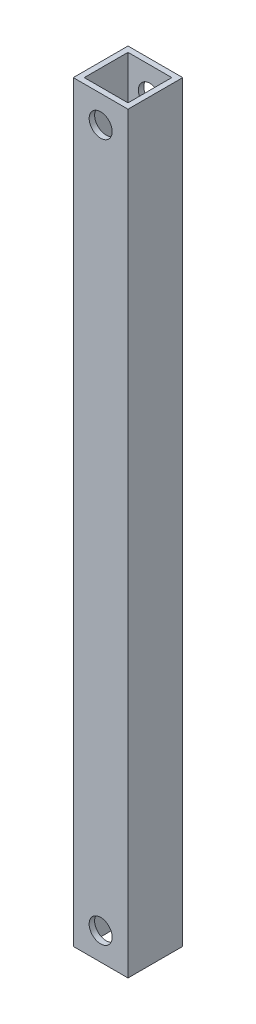
ISO-10303-21;
HEADER;
FILE_DESCRIPTION(('STEP AP214'),'2;1');
FILE_NAME('part.step','',(''),(''),'','','');
FILE_SCHEMA(('AUTOMOTIVE_DESIGN { 1 0 10303 214 1 1 1 1 }'));
ENDSEC;
DATA;
#1=APPLICATION_CONTEXT('core data for automotive mechanical design processes');
#2=APPLICATION_PROTOCOL_DEFINITION('international standard','automotive_design',2000,#1);
#3=PRODUCT_CONTEXT('',#1,'mechanical');
#4=PRODUCT('Part','Part','',(#3));
#5=PRODUCT_RELATED_PRODUCT_CATEGORY('part','',(#4));
#6=PRODUCT_DEFINITION_FORMATION('','',#4);
#7=PRODUCT_DEFINITION_CONTEXT('part definition',#1,'design');
#8=PRODUCT_DEFINITION('design','',#6,#7);
#9=PRODUCT_DEFINITION_SHAPE('','',#8);
#10=(LENGTH_UNIT() NAMED_UNIT(*) SI_UNIT(.MILLI.,.METRE.));
#11=(NAMED_UNIT(*) PLANE_ANGLE_UNIT() SI_UNIT($,.RADIAN.));
#12=(NAMED_UNIT(*) SI_UNIT($,.STERADIAN.) SOLID_ANGLE_UNIT());
#13=UNCERTAINTY_MEASURE_WITH_UNIT(LENGTH_MEASURE(1.E-05),#10,'distance_accuracy_value','');
#14=(GEOMETRIC_REPRESENTATION_CONTEXT(3) GLOBAL_UNCERTAINTY_ASSIGNED_CONTEXT((#13)) GLOBAL_UNIT_ASSIGNED_CONTEXT((#10,
#11,#12)) REPRESENTATION_CONTEXT('',''));
#15=CARTESIAN_POINT('',(0.,0.,0.));
#16=DIRECTION('',(0.,0.,1.));
#17=DIRECTION('',(1.,0.,0.));
#18=AXIS2_PLACEMENT_3D('',#15,#16,#17);
#19=CARTESIAN_POINT('',(0.,137.5,0.));
#20=DIRECTION('',(0.,1.,0.));
#21=DIRECTION('',(0.,0.,1.));
#22=AXIS2_PLACEMENT_3D('',#19,#20,#21);
#23=PLANE('',#22);
#24=DIRECTION('',(0.,0.,-1.));
#25=VECTOR('',#24,1.);
#26=CARTESIAN_POINT('',(5.,137.5,5.));
#27=LINE('',#26,#25);
#28=CARTESIAN_POINT('',(5.,137.5,5.));
#29=VERTEX_POINT('',#28);
#30=CARTESIAN_POINT('',(5.,137.5,-5.));
#31=VERTEX_POINT('',#30);
#32=EDGE_CURVE('E164',#29,#31,#27,.T.);
#33=ORIENTED_EDGE('',*,*,#32,.T.);
#34=DIRECTION('',(-1.,0.,0.));
#35=VECTOR('',#34,1.);
#36=CARTESIAN_POINT('',(-5.,137.5,-5.));
#37=LINE('',#36,#35);
#38=CARTESIAN_POINT('',(-5.,137.5,-5.));
#39=VERTEX_POINT('',#38);
#40=EDGE_CURVE('E167',#31,#39,#37,.T.);
#41=ORIENTED_EDGE('',*,*,#40,.T.);
#42=DIRECTION('',(0.,0.,1.));
#43=VECTOR('',#42,1.);
#44=CARTESIAN_POINT('',(-5.,137.5,5.));
#45=LINE('',#44,#43);
#46=CARTESIAN_POINT('',(-5.,137.5,5.));
#47=VERTEX_POINT('',#46);
#48=EDGE_CURVE('E170',#39,#47,#45,.T.);
#49=ORIENTED_EDGE('',*,*,#48,.T.);
#50=DIRECTION('',(1.,0.,0.));
#51=VECTOR('',#50,1.);
#52=CARTESIAN_POINT('',(-5.,137.5,5.));
#53=LINE('',#52,#51);
#54=EDGE_CURVE('E172',#47,#29,#53,.T.);
#55=ORIENTED_EDGE('',*,*,#54,.T.);
#56=EDGE_LOOP('',(#33,#41,#49,#55));
#57=FACE_BOUND('',#56,.T.);
#58=DIRECTION('',(-1.,0.,0.));
#59=VECTOR('',#58,1.);
#60=CARTESIAN_POINT('',(0.,137.5,-4.));
#61=LINE('',#60,#59);
#62=CARTESIAN_POINT('',(4.,137.5,-4.));
#63=VERTEX_POINT('',#62);
#64=CARTESIAN_POINT('',(-4.,137.5,-4.));
#65=VERTEX_POINT('',#64);
#66=EDGE_CURVE('E134',#63,#65,#61,.T.);
#67=ORIENTED_EDGE('',*,*,#66,.F.);
#68=DIRECTION('',(0.,0.,-1.));
#69=VECTOR('',#68,1.);
#70=CARTESIAN_POINT('',(4.,137.5,0.));
#71=LINE('',#70,#69);
#72=CARTESIAN_POINT('',(4.,137.5,4.));
#73=VERTEX_POINT('',#72);
#74=EDGE_CURVE('E126',#73,#63,#71,.T.);
#75=ORIENTED_EDGE('',*,*,#74,.F.);
#76=DIRECTION('',(1.,0.,0.));
#77=VECTOR('',#76,1.);
#78=CARTESIAN_POINT('',(0.,137.5,4.));
#79=LINE('',#78,#77);
#80=CARTESIAN_POINT('',(-4.,137.5,4.));
#81=VERTEX_POINT('',#80);
#82=EDGE_CURVE('E148',#81,#73,#79,.T.);
#83=ORIENTED_EDGE('',*,*,#82,.F.);
#84=DIRECTION('',(0.,0.,1.));
#85=VECTOR('',#84,1.);
#86=CARTESIAN_POINT('',(-4.,137.5,0.));
#87=LINE('',#86,#85);
#88=EDGE_CURVE('E146',#65,#81,#87,.T.);
#89=ORIENTED_EDGE('',*,*,#88,.F.);
#90=EDGE_LOOP('',(#67,#75,#83,#89));
#91=FACE_BOUND('',#90,.T.);
#92=ADVANCED_FACE('F59',(#57,#91),#23,.T.);
#93=CARTESIAN_POINT('',(0.,0.,0.));
#94=DIRECTION('',(0.,1.,0.));
#95=DIRECTION('',(0.,0.,1.));
#96=AXIS2_PLACEMENT_3D('',#93,#94,#95);
#97=PLANE('',#96);
#98=DIRECTION('',(0.,0.,-1.));
#99=VECTOR('',#98,1.);
#100=CARTESIAN_POINT('',(5.,0.,5.));
#101=LINE('',#100,#99);
#102=CARTESIAN_POINT('',(5.,0.,5.));
#103=VERTEX_POINT('',#102);
#104=CARTESIAN_POINT('',(5.,0.,-5.));
#105=VERTEX_POINT('',#104);
#106=EDGE_CURVE('E142',#103,#105,#101,.T.);
#107=ORIENTED_EDGE('',*,*,#106,.F.);
#108=DIRECTION('',(1.,0.,0.));
#109=VECTOR('',#108,1.);
#110=CARTESIAN_POINT('',(-5.,0.,5.));
#111=LINE('',#110,#109);
#112=CARTESIAN_POINT('',(-5.,0.,5.));
#113=VERTEX_POINT('',#112);
#114=EDGE_CURVE('E168',#113,#103,#111,.T.);
#115=ORIENTED_EDGE('',*,*,#114,.F.);
#116=DIRECTION('',(0.,0.,1.));
#117=VECTOR('',#116,1.);
#118=CARTESIAN_POINT('',(-5.,0.,5.));
#119=LINE('',#118,#117);
#120=CARTESIAN_POINT('',(-5.,0.,-5.));
#121=VERTEX_POINT('',#120);
#122=EDGE_CURVE('E179',#121,#113,#119,.T.);
#123=ORIENTED_EDGE('',*,*,#122,.F.);
#124=DIRECTION('',(-1.,0.,0.));
#125=VECTOR('',#124,1.);
#126=CARTESIAN_POINT('',(-5.,0.,-5.));
#127=LINE('',#126,#125);
#128=EDGE_CURVE('E177',#105,#121,#127,.T.);
#129=ORIENTED_EDGE('',*,*,#128,.F.);
#130=EDGE_LOOP('',(#107,#115,#123,#129));
#131=FACE_BOUND('',#130,.T.);
#132=DIRECTION('',(0.,0.,-1.));
#133=VECTOR('',#132,1.);
#134=CARTESIAN_POINT('',(4.,0.,0.));
#135=LINE('',#134,#133);
#136=CARTESIAN_POINT('',(4.,0.,4.));
#137=VERTEX_POINT('',#136);
#138=CARTESIAN_POINT('',(4.,0.,-4.));
#139=VERTEX_POINT('',#138);
#140=EDGE_CURVE('E84',#137,#139,#135,.T.);
#141=ORIENTED_EDGE('',*,*,#140,.T.);
#142=DIRECTION('',(-1.,0.,0.));
#143=VECTOR('',#142,1.);
#144=CARTESIAN_POINT('',(0.,0.,-4.));
#145=LINE('',#144,#143);
#146=CARTESIAN_POINT('',(-4.,0.,-4.));
#147=VERTEX_POINT('',#146);
#148=EDGE_CURVE('E141',#139,#147,#145,.T.);
#149=ORIENTED_EDGE('',*,*,#148,.T.);
#150=DIRECTION('',(0.,0.,1.));
#151=VECTOR('',#150,1.);
#152=CARTESIAN_POINT('',(-4.,0.,0.));
#153=LINE('',#152,#151);
#154=CARTESIAN_POINT('',(-4.,0.,4.));
#155=VERTEX_POINT('',#154);
#156=EDGE_CURVE('E156',#147,#155,#153,.T.);
#157=ORIENTED_EDGE('',*,*,#156,.T.);
#158=DIRECTION('',(1.,0.,0.));
#159=VECTOR('',#158,1.);
#160=CARTESIAN_POINT('',(0.,0.,4.));
#161=LINE('',#160,#159);
#162=EDGE_CURVE('E135',#155,#137,#161,.T.);
#163=ORIENTED_EDGE('',*,*,#162,.T.);
#164=EDGE_LOOP('',(#141,#149,#157,#163));
#165=FACE_BOUND('',#164,.T.);
#166=ADVANCED_FACE('F226',(#131,#165),#97,.F.);
#167=CARTESIAN_POINT('',(5.,137.5,5.));
#168=DIRECTION('',(-1.,0.,0.));
#169=DIRECTION('',(0.,0.,1.));
#170=AXIS2_PLACEMENT_3D('',#167,#168,#169);
#171=PLANE('',#170);
#172=ORIENTED_EDGE('',*,*,#106,.T.);
#173=DIRECTION('',(0.,-1.,0.));
#174=VECTOR('',#173,1.);
#175=CARTESIAN_POINT('',(5.,137.5,-5.));
#176=LINE('',#175,#174);
#177=EDGE_CURVE('E12',#31,#105,#176,.T.);
#178=ORIENTED_EDGE('',*,*,#177,.F.);
#179=ORIENTED_EDGE('',*,*,#32,.F.);
#180=DIRECTION('',(0.,-1.,0.));
#181=VECTOR('',#180,1.);
#182=CARTESIAN_POINT('',(5.,137.5,5.));
#183=LINE('',#182,#181);
#184=EDGE_CURVE('E174',#29,#103,#183,.T.);
#185=ORIENTED_EDGE('',*,*,#184,.T.);
#186=EDGE_LOOP('',(#172,#178,#179,#185));
#187=FACE_BOUND('',#186,.T.);
#188=ADVANCED_FACE('F61',(#187),#171,.F.);
#189=CARTESIAN_POINT('',(-5.,137.5,-5.));
#190=DIRECTION('',(0.,0.,1.));
#191=DIRECTION('',(1.,0.,0.));
#192=AXIS2_PLACEMENT_3D('',#189,#190,#191);
#193=PLANE('',#192);
#194=CARTESIAN_POINT('',(0.,132.5,-5.));
#195=DIRECTION('',(0.,0.,1.));
#196=DIRECTION('',(1.,0.,0.));
#197=AXIS2_PLACEMENT_3D('',#194,#195,#196);
#198=CIRCLE('',#197,2.1);
#199=CARTESIAN_POINT('',(2.1,132.5,-5.));
#200=VERTEX_POINT('',#199);
#201=EDGE_CURVE('E191',#200,#200,#198,.F.);
#202=ORIENTED_EDGE('',*,*,#201,.F.);
#203=EDGE_LOOP('',(#202));
#204=FACE_BOUND('',#203,.T.);
#205=CARTESIAN_POINT('',(0.,5.,-5.));
#206=DIRECTION('',(0.,0.,1.));
#207=DIRECTION('',(1.,0.,0.));
#208=AXIS2_PLACEMENT_3D('',#205,#206,#207);
#209=CIRCLE('',#208,2.1);
#210=CARTESIAN_POINT('',(2.1,5.,-5.));
#211=VERTEX_POINT('',#210);
#212=EDGE_CURVE('E202',#211,#211,#209,.F.);
#213=ORIENTED_EDGE('',*,*,#212,.F.);
#214=EDGE_LOOP('',(#213));
#215=FACE_BOUND('',#214,.T.);
#216=ORIENTED_EDGE('',*,*,#128,.T.);
#217=DIRECTION('',(0.,-1.,0.));
#218=VECTOR('',#217,1.);
#219=CARTESIAN_POINT('',(-5.,137.5,-5.));
#220=LINE('',#219,#218);
#221=EDGE_CURVE('E68',#39,#121,#220,.T.);
#222=ORIENTED_EDGE('',*,*,#221,.F.);
#223=ORIENTED_EDGE('',*,*,#40,.F.);
#224=ORIENTED_EDGE('',*,*,#177,.T.);
#225=EDGE_LOOP('',(#216,#222,#223,#224));
#226=FACE_BOUND('',#225,.T.);
#227=ADVANCED_FACE('F251',(#204,#215,#226),#193,.F.);
#228=CARTESIAN_POINT('',(-5.,137.5,5.));
#229=DIRECTION('',(1.,0.,0.));
#230=DIRECTION('',(0.,0.,-1.));
#231=AXIS2_PLACEMENT_3D('',#228,#229,#230);
#232=PLANE('',#231);
#233=ORIENTED_EDGE('',*,*,#122,.T.);
#234=DIRECTION('',(0.,-1.,0.));
#235=VECTOR('',#234,1.);
#236=CARTESIAN_POINT('',(-5.,137.5,5.));
#237=LINE('',#236,#235);
#238=EDGE_CURVE('E184',#47,#113,#237,.T.);
#239=ORIENTED_EDGE('',*,*,#238,.F.);
#240=ORIENTED_EDGE('',*,*,#48,.F.);
#241=ORIENTED_EDGE('',*,*,#221,.T.);
#242=EDGE_LOOP('',(#233,#239,#240,#241));
#243=FACE_BOUND('',#242,.T.);
#244=ADVANCED_FACE('F248',(#243),#232,.F.);
#245=CARTESIAN_POINT('',(-5.,137.5,5.));
#246=DIRECTION('',(0.,0.,-1.));
#247=DIRECTION('',(-1.,0.,0.));
#248=AXIS2_PLACEMENT_3D('',#245,#246,#247);
#249=PLANE('',#248);
#250=CARTESIAN_POINT('',(0.,132.5,5.));
#251=DIRECTION('',(0.,0.,1.));
#252=DIRECTION('',(1.,0.,0.));
#253=AXIS2_PLACEMENT_3D('',#250,#251,#252);
#254=CIRCLE('',#253,2.1);
#255=CARTESIAN_POINT('',(2.1,132.5,5.));
#256=VERTEX_POINT('',#255);
#257=EDGE_CURVE('E197',#256,#256,#254,.T.);
#258=ORIENTED_EDGE('',*,*,#257,.F.);
#259=EDGE_LOOP('',(#258));
#260=FACE_BOUND('',#259,.T.);
#261=CARTESIAN_POINT('',(0.,5.,5.));
#262=DIRECTION('',(0.,0.,1.));
#263=DIRECTION('',(-1.,0.,0.));
#264=AXIS2_PLACEMENT_3D('',#261,#262,#263);
#265=CIRCLE('',#264,2.1);
#266=CARTESIAN_POINT('',(-2.1,5.,5.));
#267=VERTEX_POINT('',#266);
#268=EDGE_CURVE('E205',#267,#267,#265,.T.);
#269=ORIENTED_EDGE('',*,*,#268,.F.);
#270=EDGE_LOOP('',(#269));
#271=FACE_BOUND('',#270,.T.);
#272=ORIENTED_EDGE('',*,*,#114,.T.);
#273=ORIENTED_EDGE('',*,*,#184,.F.);
#274=ORIENTED_EDGE('',*,*,#54,.F.);
#275=ORIENTED_EDGE('',*,*,#238,.T.);
#276=EDGE_LOOP('',(#272,#273,#274,#275));
#277=FACE_BOUND('',#276,.T.);
#278=ADVANCED_FACE('F245',(#260,#271,#277),#249,.F.);
#279=CARTESIAN_POINT('',(4.,137.5,0.));
#280=DIRECTION('',(-1.,0.,0.));
#281=DIRECTION('',(0.,0.,1.));
#282=AXIS2_PLACEMENT_3D('',#279,#280,#281);
#283=PLANE('',#282);
#284=ORIENTED_EDGE('',*,*,#140,.F.);
#285=DIRECTION('',(0.,-1.,0.));
#286=VECTOR('',#285,1.);
#287=CARTESIAN_POINT('',(4.,137.5,4.));
#288=LINE('',#287,#286);
#289=EDGE_CURVE('E130',#73,#137,#288,.T.);
#290=ORIENTED_EDGE('',*,*,#289,.F.);
#291=ORIENTED_EDGE('',*,*,#74,.T.);
#292=DIRECTION('',(0.,-1.,0.));
#293=VECTOR('',#292,1.);
#294=CARTESIAN_POINT('',(4.,137.5,-4.));
#295=LINE('',#294,#293);
#296=EDGE_CURVE('E129',#63,#139,#295,.T.);
#297=ORIENTED_EDGE('',*,*,#296,.T.);
#298=EDGE_LOOP('',(#284,#290,#291,#297));
#299=FACE_BOUND('',#298,.T.);
#300=ADVANCED_FACE('F128',(#299),#283,.T.);
#301=CARTESIAN_POINT('',(0.,137.5,-4.));
#302=DIRECTION('',(0.,0.,1.));
#303=DIRECTION('',(1.,0.,0.));
#304=AXIS2_PLACEMENT_3D('',#301,#302,#303);
#305=PLANE('',#304);
#306=CARTESIAN_POINT('',(0.,132.5,-4.));
#307=DIRECTION('',(0.,0.,1.));
#308=DIRECTION('',(1.,0.,0.));
#309=AXIS2_PLACEMENT_3D('',#306,#307,#308);
#310=CIRCLE('',#309,2.1);
#311=CARTESIAN_POINT('',(2.1,132.5,-4.));
#312=VERTEX_POINT('',#311);
#313=EDGE_CURVE('E154',#312,#312,#310,.T.);
#314=ORIENTED_EDGE('',*,*,#313,.F.);
#315=EDGE_LOOP('',(#314));
#316=FACE_BOUND('',#315,.T.);
#317=CARTESIAN_POINT('',(0.,5.,-4.));
#318=DIRECTION('',(0.,0.,1.));
#319=DIRECTION('',(1.,0.,0.));
#320=AXIS2_PLACEMENT_3D('',#317,#318,#319);
#321=CIRCLE('',#320,2.1);
#322=CARTESIAN_POINT('',(2.1,5.,-4.));
#323=VERTEX_POINT('',#322);
#324=EDGE_CURVE('E190',#323,#323,#321,.T.);
#325=ORIENTED_EDGE('',*,*,#324,.F.);
#326=EDGE_LOOP('',(#325));
#327=FACE_BOUND('',#326,.T.);
#328=ORIENTED_EDGE('',*,*,#148,.F.);
#329=ORIENTED_EDGE('',*,*,#296,.F.);
#330=ORIENTED_EDGE('',*,*,#66,.T.);
#331=DIRECTION('',(0.,-1.,0.));
#332=VECTOR('',#331,1.);
#333=CARTESIAN_POINT('',(-4.,137.5,-4.));
#334=LINE('',#333,#332);
#335=EDGE_CURVE('E143',#65,#147,#334,.T.);
#336=ORIENTED_EDGE('',*,*,#335,.T.);
#337=EDGE_LOOP('',(#328,#329,#330,#336));
#338=FACE_BOUND('',#337,.T.);
#339=ADVANCED_FACE('F138',(#316,#327,#338),#305,.T.);
#340=CARTESIAN_POINT('',(-4.,137.5,0.));
#341=DIRECTION('',(1.,0.,0.));
#342=DIRECTION('',(0.,0.,-1.));
#343=AXIS2_PLACEMENT_3D('',#340,#341,#342);
#344=PLANE('',#343);
#345=ORIENTED_EDGE('',*,*,#156,.F.);
#346=ORIENTED_EDGE('',*,*,#335,.F.);
#347=ORIENTED_EDGE('',*,*,#88,.T.);
#348=DIRECTION('',(0.,-1.,0.));
#349=VECTOR('',#348,1.);
#350=CARTESIAN_POINT('',(-4.,137.5,4.));
#351=LINE('',#350,#349);
#352=EDGE_CURVE('E76',#81,#155,#351,.T.);
#353=ORIENTED_EDGE('',*,*,#352,.T.);
#354=EDGE_LOOP('',(#345,#346,#347,#353));
#355=FACE_BOUND('',#354,.T.);
#356=ADVANCED_FACE('F222',(#355),#344,.T.);
#357=CARTESIAN_POINT('',(0.,137.5,4.));
#358=DIRECTION('',(0.,0.,-1.));
#359=DIRECTION('',(-1.,0.,0.));
#360=AXIS2_PLACEMENT_3D('',#357,#358,#359);
#361=PLANE('',#360);
#362=CARTESIAN_POINT('',(0.,132.5,4.));
#363=DIRECTION('',(0.,0.,-1.));
#364=DIRECTION('',(-1.,0.,0.));
#365=AXIS2_PLACEMENT_3D('',#362,#363,#364);
#366=CIRCLE('',#365,2.1);
#367=CARTESIAN_POINT('',(-2.1,132.5,4.));
#368=VERTEX_POINT('',#367);
#369=EDGE_CURVE('E63',#368,#368,#366,.T.);
#370=ORIENTED_EDGE('',*,*,#369,.F.);
#371=EDGE_LOOP('',(#370));
#372=FACE_BOUND('',#371,.T.);
#373=CARTESIAN_POINT('',(0.,5.,4.));
#374=DIRECTION('',(0.,0.,-1.));
#375=DIRECTION('',(-1.,0.,0.));
#376=AXIS2_PLACEMENT_3D('',#373,#374,#375);
#377=CIRCLE('',#376,2.1);
#378=CARTESIAN_POINT('',(-2.1,5.,4.));
#379=VERTEX_POINT('',#378);
#380=EDGE_CURVE('E188',#379,#379,#377,.T.);
#381=ORIENTED_EDGE('',*,*,#380,.F.);
#382=EDGE_LOOP('',(#381));
#383=FACE_BOUND('',#382,.T.);
#384=ORIENTED_EDGE('',*,*,#162,.F.);
#385=ORIENTED_EDGE('',*,*,#352,.F.);
#386=ORIENTED_EDGE('',*,*,#82,.T.);
#387=ORIENTED_EDGE('',*,*,#289,.T.);
#388=EDGE_LOOP('',(#384,#385,#386,#387));
#389=FACE_BOUND('',#388,.T.);
#390=ADVANCED_FACE('F218',(#372,#383,#389),#361,.T.);
#391=CARTESIAN_POINT('',(0.,5.,-10.939696961967));
#392=DIRECTION('',(0.,0.,1.));
#393=DIRECTION('',(1.,0.,0.));
#394=AXIS2_PLACEMENT_3D('',#391,#392,#393);
#395=CYLINDRICAL_SURFACE('',#394,2.1);
#396=ORIENTED_EDGE('',*,*,#380,.T.);
#397=EDGE_LOOP('',(#396));
#398=FACE_BOUND('',#397,.T.);
#399=ORIENTED_EDGE('',*,*,#268,.T.);
#400=EDGE_LOOP('',(#399));
#401=FACE_BOUND('',#400,.T.);
#402=ADVANCED_FACE('F221',(#398,#401),#395,.F.);
#403=CARTESIAN_POINT('',(0.,132.5,-10.939696961967));
#404=DIRECTION('',(0.,0.,1.));
#405=DIRECTION('',(1.,0.,0.));
#406=AXIS2_PLACEMENT_3D('',#403,#404,#405);
#407=CYLINDRICAL_SURFACE('',#406,2.1);
#408=ORIENTED_EDGE('',*,*,#369,.T.);
#409=EDGE_LOOP('',(#408));
#410=FACE_BOUND('',#409,.T.);
#411=ORIENTED_EDGE('',*,*,#257,.T.);
#412=EDGE_LOOP('',(#411));
#413=FACE_BOUND('',#412,.T.);
#414=ADVANCED_FACE('F215',(#410,#413),#407,.F.);
#415=ORIENTED_EDGE('',*,*,#324,.T.);
#416=EDGE_LOOP('',(#415));
#417=FACE_BOUND('',#416,.T.);
#418=ORIENTED_EDGE('',*,*,#212,.T.);
#419=EDGE_LOOP('',(#418));
#420=FACE_BOUND('',#419,.T.);
#421=ADVANCED_FACE('F274',(#417,#420),#395,.F.);
#422=ORIENTED_EDGE('',*,*,#313,.T.);
#423=EDGE_LOOP('',(#422));
#424=FACE_BOUND('',#423,.T.);
#425=ORIENTED_EDGE('',*,*,#201,.T.);
#426=EDGE_LOOP('',(#425));
#427=FACE_BOUND('',#426,.T.);
#428=ADVANCED_FACE('F276',(#424,#427),#407,.F.);
#429=CLOSED_SHELL('',(#92,#166,#188,#227,#244,#278,#300,#339,#356,#390,#402,#414,#421,#428));
#430=MANIFOLD_SOLID_BREP('B2',#429);
#431=ADVANCED_BREP_SHAPE_REPRESENTATION('',(#18,#430),#14);
#432=SHAPE_DEFINITION_REPRESENTATION(#9,#431);
ENDSEC;
END-ISO-10303-21;
